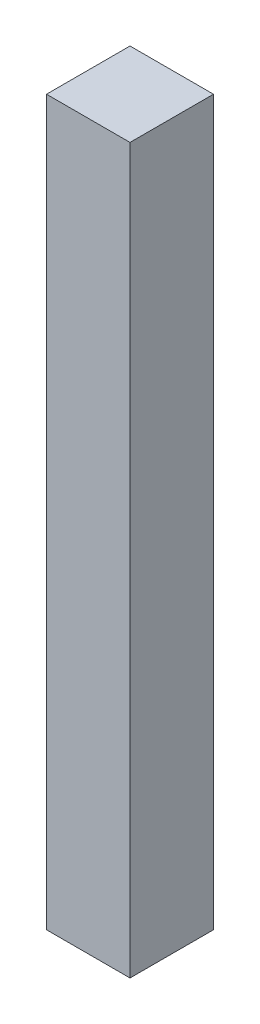
ISO-10303-21;
HEADER;
FILE_DESCRIPTION(('STEP AP214'),'2;1');
FILE_NAME('part.step','',(''),(''),'','','');
FILE_SCHEMA(('AUTOMOTIVE_DESIGN { 1 0 10303 214 1 1 1 1 }'));
ENDSEC;
DATA;
#1=APPLICATION_CONTEXT('core data for automotive mechanical design processes');
#2=APPLICATION_PROTOCOL_DEFINITION('international standard','automotive_design',2000,#1);
#3=PRODUCT_CONTEXT('',#1,'mechanical');
#4=PRODUCT('Part','Part','',(#3));
#5=PRODUCT_RELATED_PRODUCT_CATEGORY('part','',(#4));
#6=PRODUCT_DEFINITION_FORMATION('','',#4);
#7=PRODUCT_DEFINITION_CONTEXT('part definition',#1,'design');
#8=PRODUCT_DEFINITION('design','',#6,#7);
#9=PRODUCT_DEFINITION_SHAPE('','',#8);
#10=(LENGTH_UNIT() NAMED_UNIT(*) SI_UNIT(.MILLI.,.METRE.));
#11=(NAMED_UNIT(*) PLANE_ANGLE_UNIT() SI_UNIT($,.RADIAN.));
#12=(NAMED_UNIT(*) SI_UNIT($,.STERADIAN.) SOLID_ANGLE_UNIT());
#13=UNCERTAINTY_MEASURE_WITH_UNIT(LENGTH_MEASURE(1.E-05),#10,'distance_accuracy_value','');
#14=(GEOMETRIC_REPRESENTATION_CONTEXT(3) GLOBAL_UNCERTAINTY_ASSIGNED_CONTEXT((#13)) GLOBAL_UNIT_ASSIGNED_CONTEXT((#10,
#11,#12)) REPRESENTATION_CONTEXT('',''));
#15=CARTESIAN_POINT('',(0.,0.,0.));
#16=DIRECTION('',(0.,0.,1.));
#17=DIRECTION('',(1.,0.,0.));
#18=AXIS2_PLACEMENT_3D('',#15,#16,#17);
#19=CARTESIAN_POINT('',(0.,330.2,0.));
#20=DIRECTION('',(1.,0.,0.));
#21=DIRECTION('',(0.,0.,-1.));
#22=AXIS2_PLACEMENT_3D('',#19,#20,#21);
#23=PLANE('',#22);
#24=DIRECTION('',(0.,0.,1.));
#25=VECTOR('',#24,1.);
#26=CARTESIAN_POINT('',(0.,0.,0.));
#27=LINE('',#26,#25);
#28=CARTESIAN_POINT('',(0.,0.,0.));
#29=VERTEX_POINT('',#28);
#30=CARTESIAN_POINT('',(0.,0.,38.1));
#31=VERTEX_POINT('',#30);
#32=EDGE_CURVE('E111',#29,#31,#27,.T.);
#33=ORIENTED_EDGE('',*,*,#32,.T.);
#34=DIRECTION('',(0.,-1.,0.));
#35=VECTOR('',#34,1.);
#36=CARTESIAN_POINT('',(0.,330.2,38.1));
#37=LINE('',#36,#35);
#38=CARTESIAN_POINT('',(0.,330.2,38.1));
#39=VERTEX_POINT('',#38);
#40=EDGE_CURVE('E11',#39,#31,#37,.T.);
#41=ORIENTED_EDGE('',*,*,#40,.F.);
#42=DIRECTION('',(0.,0.,1.));
#43=VECTOR('',#42,1.);
#44=CARTESIAN_POINT('',(0.,330.2,0.));
#45=LINE('',#44,#43);
#46=CARTESIAN_POINT('',(0.,330.2,0.));
#47=VERTEX_POINT('',#46);
#48=EDGE_CURVE('E95',#47,#39,#45,.T.);
#49=ORIENTED_EDGE('',*,*,#48,.F.);
#50=DIRECTION('',(0.,-1.,0.));
#51=VECTOR('',#50,1.);
#52=CARTESIAN_POINT('',(0.,330.2,0.));
#53=LINE('',#52,#51);
#54=EDGE_CURVE('E107',#47,#29,#53,.T.);
#55=ORIENTED_EDGE('',*,*,#54,.T.);
#56=EDGE_LOOP('',(#33,#41,#49,#55));
#57=FACE_BOUND('',#56,.T.);
#58=ADVANCED_FACE('F43',(#57),#23,.F.);
#59=CARTESIAN_POINT('',(0.,330.2,38.1));
#60=DIRECTION('',(0.,0.,-1.));
#61=DIRECTION('',(-1.,0.,0.));
#62=AXIS2_PLACEMENT_3D('',#59,#60,#61);
#63=PLANE('',#62);
#64=DIRECTION('',(1.,0.,0.));
#65=VECTOR('',#64,1.);
#66=CARTESIAN_POINT('',(0.,0.,38.1));
#67=LINE('',#66,#65);
#68=CARTESIAN_POINT('',(38.1,0.,38.1));
#69=VERTEX_POINT('',#68);
#70=EDGE_CURVE('E100',#31,#69,#67,.T.);
#71=ORIENTED_EDGE('',*,*,#70,.T.);
#72=DIRECTION('',(0.,-1.,0.));
#73=VECTOR('',#72,1.);
#74=CARTESIAN_POINT('',(38.1,330.2,38.1));
#75=LINE('',#74,#73);
#76=CARTESIAN_POINT('',(38.1,330.2,38.1));
#77=VERTEX_POINT('',#76);
#78=EDGE_CURVE('E52',#77,#69,#75,.T.);
#79=ORIENTED_EDGE('',*,*,#78,.F.);
#80=DIRECTION('',(1.,0.,0.));
#81=VECTOR('',#80,1.);
#82=CARTESIAN_POINT('',(0.,330.2,38.1));
#83=LINE('',#82,#81);
#84=EDGE_CURVE('E90',#39,#77,#83,.T.);
#85=ORIENTED_EDGE('',*,*,#84,.F.);
#86=ORIENTED_EDGE('',*,*,#40,.T.);
#87=EDGE_LOOP('',(#71,#79,#85,#86));
#88=FACE_BOUND('',#87,.T.);
#89=ADVANCED_FACE('F99',(#88),#63,.F.);
#90=CARTESIAN_POINT('',(38.1,330.2,0.));
#91=DIRECTION('',(-1.,0.,0.));
#92=DIRECTION('',(0.,0.,1.));
#93=AXIS2_PLACEMENT_3D('',#90,#91,#92);
#94=PLANE('',#93);
#95=DIRECTION('',(0.,0.,-1.));
#96=VECTOR('',#95,1.);
#97=CARTESIAN_POINT('',(38.1,0.,0.));
#98=LINE('',#97,#96);
#99=CARTESIAN_POINT('',(38.1,0.,0.));
#100=VERTEX_POINT('',#99);
#101=EDGE_CURVE('E77',#69,#100,#98,.T.);
#102=ORIENTED_EDGE('',*,*,#101,.T.);
#103=DIRECTION('',(0.,-1.,0.));
#104=VECTOR('',#103,1.);
#105=CARTESIAN_POINT('',(38.1,330.2,0.));
#106=LINE('',#105,#104);
#107=CARTESIAN_POINT('',(38.1,330.2,0.));
#108=VERTEX_POINT('',#107);
#109=EDGE_CURVE('E102',#108,#100,#106,.T.);
#110=ORIENTED_EDGE('',*,*,#109,.F.);
#111=DIRECTION('',(0.,0.,-1.));
#112=VECTOR('',#111,1.);
#113=CARTESIAN_POINT('',(38.1,330.2,0.));
#114=LINE('',#113,#112);
#115=EDGE_CURVE('E93',#77,#108,#114,.T.);
#116=ORIENTED_EDGE('',*,*,#115,.F.);
#117=ORIENTED_EDGE('',*,*,#78,.T.);
#118=EDGE_LOOP('',(#102,#110,#116,#117));
#119=FACE_BOUND('',#118,.T.);
#120=ADVANCED_FACE('F103',(#119),#94,.F.);
#121=CARTESIAN_POINT('',(0.,330.2,0.));
#122=DIRECTION('',(0.,0.,1.));
#123=DIRECTION('',(1.,0.,0.));
#124=AXIS2_PLACEMENT_3D('',#121,#122,#123);
#125=PLANE('',#124);
#126=DIRECTION('',(-1.,0.,0.));
#127=VECTOR('',#126,1.);
#128=CARTESIAN_POINT('',(0.,0.,0.));
#129=LINE('',#128,#127);
#130=EDGE_CURVE('E83',#100,#29,#129,.T.);
#131=ORIENTED_EDGE('',*,*,#130,.T.);
#132=ORIENTED_EDGE('',*,*,#54,.F.);
#133=DIRECTION('',(-1.,0.,0.));
#134=VECTOR('',#133,1.);
#135=CARTESIAN_POINT('',(0.,330.2,0.));
#136=LINE('',#135,#134);
#137=EDGE_CURVE('E60',#108,#47,#136,.T.);
#138=ORIENTED_EDGE('',*,*,#137,.F.);
#139=ORIENTED_EDGE('',*,*,#109,.T.);
#140=EDGE_LOOP('',(#131,#132,#138,#139));
#141=FACE_BOUND('',#140,.T.);
#142=ADVANCED_FACE('F124',(#141),#125,.F.);
#143=CARTESIAN_POINT('',(0.,330.2,0.));
#144=DIRECTION('',(0.,1.,0.));
#145=DIRECTION('',(0.,0.,1.));
#146=AXIS2_PLACEMENT_3D('',#143,#144,#145);
#147=PLANE('',#146);
#148=ORIENTED_EDGE('',*,*,#48,.T.);
#149=ORIENTED_EDGE('',*,*,#84,.T.);
#150=ORIENTED_EDGE('',*,*,#115,.T.);
#151=ORIENTED_EDGE('',*,*,#137,.T.);
#152=EDGE_LOOP('',(#148,#149,#150,#151));
#153=FACE_BOUND('',#152,.T.);
#154=ADVANCED_FACE('F91',(#153),#147,.T.);
#155=CARTESIAN_POINT('',(0.,0.,0.));
#156=DIRECTION('',(0.,1.,0.));
#157=DIRECTION('',(0.,0.,1.));
#158=AXIS2_PLACEMENT_3D('',#155,#156,#157);
#159=PLANE('',#158);
#160=ORIENTED_EDGE('',*,*,#32,.F.);
#161=ORIENTED_EDGE('',*,*,#130,.F.);
#162=ORIENTED_EDGE('',*,*,#101,.F.);
#163=ORIENTED_EDGE('',*,*,#70,.F.);
#164=EDGE_LOOP('',(#160,#161,#162,#163));
#165=FACE_BOUND('',#164,.T.);
#166=ADVANCED_FACE('F127',(#165),#159,.F.);
#167=CLOSED_SHELL('',(#58,#89,#120,#142,#154,#166));
#168=MANIFOLD_SOLID_BREP('B2',#167);
#169=ADVANCED_BREP_SHAPE_REPRESENTATION('',(#18,#168),#14);
#170=SHAPE_DEFINITION_REPRESENTATION(#9,#169);
ENDSEC;
END-ISO-10303-21;
